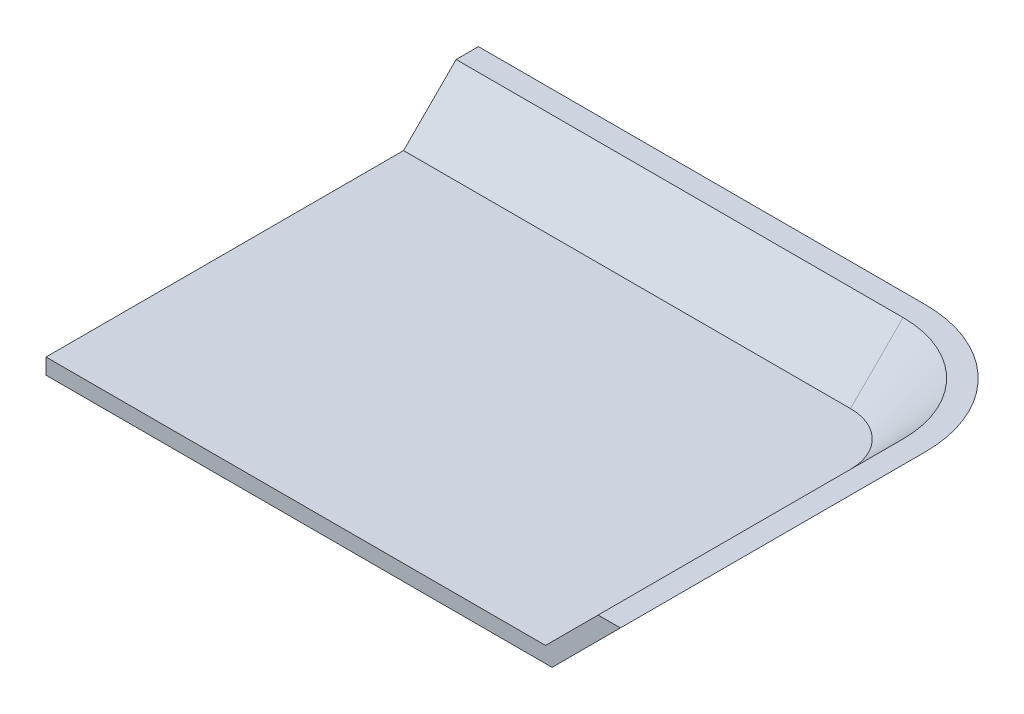
ISO-10303-21;
HEADER;
FILE_DESCRIPTION(('STEP AP214'),'2;1');
FILE_NAME('part.step','',(''),(''),'','','');
FILE_SCHEMA(('AUTOMOTIVE_DESIGN { 1 0 10303 214 1 1 1 1 }'));
ENDSEC;
DATA;
#1=APPLICATION_CONTEXT('core data for automotive mechanical design processes');
#2=APPLICATION_PROTOCOL_DEFINITION('international standard','automotive_design',2000,#1);
#3=PRODUCT_CONTEXT('',#1,'mechanical');
#4=PRODUCT('Part','Part','',(#3));
#5=PRODUCT_RELATED_PRODUCT_CATEGORY('part','',(#4));
#6=PRODUCT_DEFINITION_FORMATION('','',#4);
#7=PRODUCT_DEFINITION_CONTEXT('part definition',#1,'design');
#8=PRODUCT_DEFINITION('design','',#6,#7);
#9=PRODUCT_DEFINITION_SHAPE('','',#8);
#10=(LENGTH_UNIT() NAMED_UNIT(*) SI_UNIT(.MILLI.,.METRE.));
#11=(NAMED_UNIT(*) PLANE_ANGLE_UNIT() SI_UNIT($,.RADIAN.));
#12=(NAMED_UNIT(*) SI_UNIT($,.STERADIAN.) SOLID_ANGLE_UNIT());
#13=UNCERTAINTY_MEASURE_WITH_UNIT(LENGTH_MEASURE(1.E-05),#10,'distance_accuracy_value','');
#14=(GEOMETRIC_REPRESENTATION_CONTEXT(3) GLOBAL_UNCERTAINTY_ASSIGNED_CONTEXT((#13)) GLOBAL_UNIT_ASSIGNED_CONTEXT((#10,
#11,#12)) REPRESENTATION_CONTEXT('',''));
#15=CARTESIAN_POINT('',(0.,0.,0.));
#16=DIRECTION('',(0.,0.,1.));
#17=DIRECTION('',(1.,0.,0.));
#18=AXIS2_PLACEMENT_3D('',#15,#16,#17);
#19=CARTESIAN_POINT('',(0.,10.,0.));
#20=DIRECTION('',(0.,1.,0.));
#21=DIRECTION('',(0.,0.,1.));
#22=AXIS2_PLACEMENT_3D('',#19,#20,#21);
#23=PLANE('',#22);
#24=DIRECTION('',(-1.,0.,0.));
#25=VECTOR('',#24,1.);
#26=CARTESIAN_POINT('',(0.,10.,0.));
#27=LINE('',#26,#25);
#28=CARTESIAN_POINT('',(109.242640687119,10.,0.));
#29=VERTEX_POINT('',#28);
#30=CARTESIAN_POINT('',(105.,10.,0.));
#31=VERTEX_POINT('',#30);
#32=EDGE_CURVE('E121',#29,#31,#27,.T.);
#33=ORIENTED_EDGE('',*,*,#32,.F.);
#34=DIRECTION('',(0.,0.,-1.));
#35=VECTOR('',#34,1.);
#36=CARTESIAN_POINT('',(109.242640687119,10.,0.));
#37=LINE('',#36,#35);
#38=CARTESIAN_POINT('',(109.242640687119,10.,-58.));
#39=VERTEX_POINT('',#38);
#40=EDGE_CURVE('E131',#29,#39,#37,.T.);
#41=ORIENTED_EDGE('',*,*,#40,.T.);
#42=CARTESIAN_POINT('',(85.,10.,-58.));
#43=DIRECTION('',(0.,-1.,0.));
#44=DIRECTION('',(0.,0.,-1.));
#45=AXIS2_PLACEMENT_3D('',#42,#43,#44);
#46=CIRCLE('',#45,24.2426406871193);
#47=CARTESIAN_POINT('',(85.,10.,-82.2426406871193));
#48=VERTEX_POINT('',#47);
#49=EDGE_CURVE('E143',#48,#39,#46,.T.);
#50=ORIENTED_EDGE('',*,*,#49,.F.);
#51=DIRECTION('',(-1.,0.,0.));
#52=VECTOR('',#51,1.);
#53=CARTESIAN_POINT('',(0.,10.,-82.2426406871193));
#54=LINE('',#53,#52);
#55=CARTESIAN_POINT('',(0.,10.,-82.2426406871193));
#56=VERTEX_POINT('',#55);
#57=EDGE_CURVE('E137',#48,#56,#54,.T.);
#58=ORIENTED_EDGE('',*,*,#57,.T.);
#59=DIRECTION('',(0.,0.,-1.));
#60=VECTOR('',#59,1.);
#61=CARTESIAN_POINT('',(0.,10.,0.));
#62=LINE('',#61,#60);
#63=CARTESIAN_POINT('',(0.,10.,-78.));
#64=VERTEX_POINT('',#63);
#65=EDGE_CURVE('E132',#64,#56,#62,.T.);
#66=ORIENTED_EDGE('',*,*,#65,.F.);
#67=DIRECTION('',(-1.,0.,0.));
#68=VECTOR('',#67,1.);
#69=CARTESIAN_POINT('',(0.,10.,-78.));
#70=LINE('',#69,#68);
#71=CARTESIAN_POINT('',(85.,10.,-78.));
#72=VERTEX_POINT('',#71);
#73=EDGE_CURVE('E70',#72,#64,#70,.T.);
#74=ORIENTED_EDGE('',*,*,#73,.F.);
#75=CARTESIAN_POINT('',(85.,10.,-58.));
#76=DIRECTION('',(0.,-1.,0.));
#77=DIRECTION('',(0.,0.,-1.));
#78=AXIS2_PLACEMENT_3D('',#75,#76,#77);
#79=CIRCLE('',#78,20.);
#80=CARTESIAN_POINT('',(105.,10.,-58.));
#81=VERTEX_POINT('',#80);
#82=EDGE_CURVE('E37',#72,#81,#79,.T.);
#83=ORIENTED_EDGE('',*,*,#82,.T.);
#84=DIRECTION('',(0.,0.,-1.));
#85=VECTOR('',#84,1.);
#86=CARTESIAN_POINT('',(105.,10.,0.));
#87=LINE('',#86,#85);
#88=EDGE_CURVE('E49',#31,#81,#87,.T.);
#89=ORIENTED_EDGE('',*,*,#88,.F.);
#90=EDGE_LOOP('',(#33,#41,#50,#58,#66,#74,#83,#89));
#91=FACE_BOUND('',#90,.T.);
#92=ADVANCED_FACE('F33',(#91),#23,.T.);
#93=CARTESIAN_POINT('',(0.,10.,0.));
#94=DIRECTION('',(-1.,0.,0.));
#95=DIRECTION('',(0.,0.,1.));
#96=AXIS2_PLACEMENT_3D('',#93,#94,#95);
#97=PLANE('',#96);
#98=DIRECTION('',(0.,0.707106781186549,-0.707106781186546));
#99=VECTOR('',#98,1.);
#100=CARTESIAN_POINT('',(0.,-29.,-39.0000000000002));
#101=LINE('',#100,#99);
#102=CARTESIAN_POINT('',(0.,0.,-68.));
#103=VERTEX_POINT('',#102);
#104=EDGE_CURVE('E160',#103,#64,#101,.T.);
#105=ORIENTED_EDGE('',*,*,#104,.T.);
#106=ORIENTED_EDGE('',*,*,#65,.T.);
#107=DIRECTION('',(0.,0.707106781186549,-0.707106781186546));
#108=VECTOR('',#107,1.);
#109=CARTESIAN_POINT('',(0.,-31.1213203435596,-41.1213203435598));
#110=LINE('',#109,#108);
#111=CARTESIAN_POINT('',(0.,-3.,-69.2426406871193));
#112=VERTEX_POINT('',#111);
#113=EDGE_CURVE('E127',#112,#56,#110,.T.);
#114=ORIENTED_EDGE('',*,*,#113,.F.);
#115=DIRECTION('',(0.,0.,1.));
#116=VECTOR('',#115,1.);
#117=CARTESIAN_POINT('',(0.,-3.,0.));
#118=LINE('',#117,#116);
#119=CARTESIAN_POINT('',(0.,-3.,0.));
#120=VERTEX_POINT('',#119);
#121=EDGE_CURVE('E172',#112,#120,#118,.T.);
#122=ORIENTED_EDGE('',*,*,#121,.T.);
#123=DIRECTION('',(0.,-1.,0.));
#124=VECTOR('',#123,1.);
#125=CARTESIAN_POINT('',(0.,10.,0.));
#126=LINE('',#125,#124);
#127=CARTESIAN_POINT('',(0.,0.,0.));
#128=VERTEX_POINT('',#127);
#129=EDGE_CURVE('E145',#128,#120,#126,.T.);
#130=ORIENTED_EDGE('',*,*,#129,.F.);
#131=DIRECTION('',(0.,0.,1.));
#132=VECTOR('',#131,1.);
#133=CARTESIAN_POINT('',(0.,0.,0.));
#134=LINE('',#133,#132);
#135=EDGE_CURVE('E149',#103,#128,#134,.T.);
#136=ORIENTED_EDGE('',*,*,#135,.F.);
#137=EDGE_LOOP('',(#105,#106,#114,#122,#130,#136));
#138=FACE_BOUND('',#137,.T.);
#139=ADVANCED_FACE('F184',(#138),#97,.T.);
#140=CARTESIAN_POINT('',(0.,-2.12132034355964,-70.1213203435597));
#141=DIRECTION('',(0.,-0.707106781186546,-0.707106781186549));
#142=DIRECTION('',(1.,0.,0.));
#143=AXIS2_PLACEMENT_3D('',#140,#141,#142);
#144=PLANE('',#143);
#145=ORIENTED_EDGE('',*,*,#113,.T.);
#146=ORIENTED_EDGE('',*,*,#57,.F.);
#147=DIRECTION('',(0.,0.70710678118655,-0.707106781186545));
#148=VECTOR('',#147,1.);
#149=CARTESIAN_POINT('',(85.,-2.12132034355964,-70.1213203435597));
#150=LINE('',#149,#148);
#151=CARTESIAN_POINT('',(85.,-3.,-69.2426406871193));
#152=VERTEX_POINT('',#151);
#153=EDGE_CURVE('E170',#48,#152,#150,.F.);
#154=ORIENTED_EDGE('',*,*,#153,.T.);
#155=DIRECTION('',(-1.,0.,0.));
#156=VECTOR('',#155,1.);
#157=CARTESIAN_POINT('',(0.,-3.,-69.2426406871193));
#158=LINE('',#157,#156);
#159=EDGE_CURVE('E146',#152,#112,#158,.T.);
#160=ORIENTED_EDGE('',*,*,#159,.T.);
#161=EDGE_LOOP('',(#145,#146,#154,#160));
#162=FACE_BOUND('',#161,.T.);
#163=ADVANCED_FACE('F180',(#162),#144,.T.);
#164=CARTESIAN_POINT('',(85.,-2.12132034355964,-58.));
#165=DIRECTION('',(0.,1.,0.));
#166=DIRECTION('',(0.,0.,-1.));
#167=AXIS2_PLACEMENT_3D('',#164,#165,#166);
#168=CONICAL_SURFACE('',#167,12.1213203435597,0.785398163397445);
#169=ORIENTED_EDGE('',*,*,#153,.F.);
#170=ORIENTED_EDGE('',*,*,#49,.T.);
#171=DIRECTION('',(0.707106781186547,0.707106781186548,0.));
#172=VECTOR('',#171,1.);
#173=CARTESIAN_POINT('',(97.1213203435596,-2.12132034355964,-58.));
#174=LINE('',#173,#172);
#175=CARTESIAN_POINT('',(96.2426406871193,-3.,-58.));
#176=VERTEX_POINT('',#175);
#177=EDGE_CURVE('E135',#39,#176,#174,.F.);
#178=ORIENTED_EDGE('',*,*,#177,.T.);
#179=CARTESIAN_POINT('',(85.,-3.,-58.));
#180=DIRECTION('',(0.,-1.,0.));
#181=DIRECTION('',(0.,0.,-1.));
#182=AXIS2_PLACEMENT_3D('',#179,#180,#181);
#183=CIRCLE('',#182,11.2426406871193);
#184=EDGE_CURVE('E166',#176,#152,#183,.F.);
#185=ORIENTED_EDGE('',*,*,#184,.T.);
#186=EDGE_LOOP('',(#169,#170,#178,#185));
#187=FACE_BOUND('',#186,.T.);
#188=ADVANCED_FACE('F186',(#187),#168,.T.);
#189=CARTESIAN_POINT('',(0.,-3.,0.));
#190=DIRECTION('',(0.,1.,0.));
#191=DIRECTION('',(0.,0.,-1.));
#192=AXIS2_PLACEMENT_3D('',#189,#190,#191);
#193=PLANE('',#192);
#194=DIRECTION('',(1.,0.,0.));
#195=VECTOR('',#194,1.);
#196=CARTESIAN_POINT('',(0.,-3.,0.));
#197=LINE('',#196,#195);
#198=CARTESIAN_POINT('',(96.2426406871193,-3.,0.));
#199=VERTEX_POINT('',#198);
#200=EDGE_CURVE('E122',#120,#199,#197,.T.);
#201=ORIENTED_EDGE('',*,*,#200,.F.);
#202=ORIENTED_EDGE('',*,*,#121,.F.);
#203=ORIENTED_EDGE('',*,*,#159,.F.);
#204=ORIENTED_EDGE('',*,*,#184,.F.);
#205=DIRECTION('',(0.,0.,-1.));
#206=VECTOR('',#205,1.);
#207=CARTESIAN_POINT('',(96.2426406871193,-3.,0.));
#208=LINE('',#207,#206);
#209=EDGE_CURVE('E126',#199,#176,#208,.T.);
#210=ORIENTED_EDGE('',*,*,#209,.F.);
#211=EDGE_LOOP('',(#201,#202,#203,#204,#210));
#212=FACE_BOUND('',#211,.T.);
#213=ADVANCED_FACE('F189',(#212),#193,.F.);
#214=CARTESIAN_POINT('',(0.,0.,0.));
#215=DIRECTION('',(0.,1.,0.));
#216=DIRECTION('',(0.,0.,-1.));
#217=AXIS2_PLACEMENT_3D('',#214,#215,#216);
#218=PLANE('',#217);
#219=DIRECTION('',(1.,0.,0.));
#220=VECTOR('',#219,1.);
#221=CARTESIAN_POINT('',(0.,0.,0.));
#222=LINE('',#221,#220);
#223=CARTESIAN_POINT('',(95.,0.,0.));
#224=VERTEX_POINT('',#223);
#225=EDGE_CURVE('E58',#128,#224,#222,.T.);
#226=ORIENTED_EDGE('',*,*,#225,.T.);
#227=DIRECTION('',(0.,0.,-1.));
#228=VECTOR('',#227,1.);
#229=CARTESIAN_POINT('',(95.,0.,-58.));
#230=LINE('',#229,#228);
#231=CARTESIAN_POINT('',(95.,0.,-58.));
#232=VERTEX_POINT('',#231);
#233=EDGE_CURVE('E155',#224,#232,#230,.T.);
#234=ORIENTED_EDGE('',*,*,#233,.T.);
#235=CARTESIAN_POINT('',(85.,0.,-58.));
#236=DIRECTION('',(0.,-1.,0.));
#237=DIRECTION('',(0.,0.,-1.));
#238=AXIS2_PLACEMENT_3D('',#235,#236,#237);
#239=CIRCLE('',#238,10.);
#240=CARTESIAN_POINT('',(85.,0.,-68.));
#241=VERTEX_POINT('',#240);
#242=EDGE_CURVE('E153',#232,#241,#239,.F.);
#243=ORIENTED_EDGE('',*,*,#242,.T.);
#244=DIRECTION('',(-1.,0.,0.));
#245=VECTOR('',#244,1.);
#246=CARTESIAN_POINT('',(0.,0.,-68.));
#247=LINE('',#246,#245);
#248=EDGE_CURVE('E80',#241,#103,#247,.T.);
#249=ORIENTED_EDGE('',*,*,#248,.T.);
#250=ORIENTED_EDGE('',*,*,#135,.T.);
#251=EDGE_LOOP('',(#226,#234,#243,#249,#250));
#252=FACE_BOUND('',#251,.T.);
#253=ADVANCED_FACE('F193',(#252),#218,.T.);
#254=CARTESIAN_POINT('',(85.,0.,-58.));
#255=DIRECTION('',(0.,1.,0.));
#256=DIRECTION('',(0.,0.,-1.));
#257=AXIS2_PLACEMENT_3D('',#254,#255,#256);
#258=CONICAL_SURFACE('',#257,10.,0.785398163397445);
#259=DIRECTION('',(0.,-0.707106781186549,0.707106781186546));
#260=VECTOR('',#259,1.);
#261=CARTESIAN_POINT('',(85.,10.,-78.));
#262=LINE('',#261,#260);
#263=EDGE_CURVE('E42',#72,#241,#262,.T.);
#264=ORIENTED_EDGE('',*,*,#263,.T.);
#265=ORIENTED_EDGE('',*,*,#242,.F.);
#266=DIRECTION('',(-0.707106781186546,-0.707106781186549,0.));
#267=VECTOR('',#266,1.);
#268=CARTESIAN_POINT('',(105.,10.,-58.));
#269=LINE('',#268,#267);
#270=EDGE_CURVE('E12',#81,#232,#269,.T.);
#271=ORIENTED_EDGE('',*,*,#270,.F.);
#272=ORIENTED_EDGE('',*,*,#82,.F.);
#273=EDGE_LOOP('',(#264,#265,#271,#272));
#274=FACE_BOUND('',#273,.T.);
#275=ADVANCED_FACE('F196',(#274),#258,.F.);
#276=CARTESIAN_POINT('',(0.,10.,0.));
#277=DIRECTION('',(0.,0.,1.));
#278=DIRECTION('',(1.,0.,0.));
#279=AXIS2_PLACEMENT_3D('',#276,#277,#278);
#280=PLANE('',#279);
#281=DIRECTION('',(-0.707106781186547,-0.707106781186548,0.));
#282=VECTOR('',#281,1.);
#283=CARTESIAN_POINT('',(54.6213203435597,-44.6213203435596,0.));
#284=LINE('',#283,#282);
#285=EDGE_CURVE('E119',#29,#199,#284,.T.);
#286=ORIENTED_EDGE('',*,*,#285,.F.);
#287=ORIENTED_EDGE('',*,*,#32,.T.);
#288=DIRECTION('',(-0.707106781186547,-0.707106781186548,0.));
#289=VECTOR('',#288,1.);
#290=CARTESIAN_POINT('',(52.5,-42.5,0.));
#291=LINE('',#290,#289);
#292=EDGE_CURVE('E158',#31,#224,#291,.T.);
#293=ORIENTED_EDGE('',*,*,#292,.T.);
#294=ORIENTED_EDGE('',*,*,#225,.F.);
#295=ORIENTED_EDGE('',*,*,#129,.T.);
#296=ORIENTED_EDGE('',*,*,#200,.T.);
#297=EDGE_LOOP('',(#286,#287,#293,#294,#295,#296));
#298=FACE_BOUND('',#297,.T.);
#299=ADVANCED_FACE('F35',(#298),#280,.T.);
#300=CARTESIAN_POINT('',(95.,0.,0.));
#301=DIRECTION('',(0.707106781186548,-0.707106781186547,0.));
#302=DIRECTION('',(0.,0.,1.));
#303=AXIS2_PLACEMENT_3D('',#300,#301,#302);
#304=PLANE('',#303);
#305=ORIENTED_EDGE('',*,*,#292,.F.);
#306=ORIENTED_EDGE('',*,*,#88,.T.);
#307=ORIENTED_EDGE('',*,*,#270,.T.);
#308=ORIENTED_EDGE('',*,*,#233,.F.);
#309=EDGE_LOOP('',(#305,#306,#307,#308));
#310=FACE_BOUND('',#309,.T.);
#311=ADVANCED_FACE('F197',(#310),#304,.F.);
#312=CARTESIAN_POINT('',(97.1213203435596,-2.12132034355964,0.));
#313=DIRECTION('',(0.707106781186548,-0.707106781186547,0.));
#314=DIRECTION('',(0.,0.,1.));
#315=AXIS2_PLACEMENT_3D('',#312,#313,#314);
#316=PLANE('',#315);
#317=ORIENTED_EDGE('',*,*,#285,.T.);
#318=ORIENTED_EDGE('',*,*,#209,.T.);
#319=ORIENTED_EDGE('',*,*,#177,.F.);
#320=ORIENTED_EDGE('',*,*,#40,.F.);
#321=EDGE_LOOP('',(#317,#318,#319,#320));
#322=FACE_BOUND('',#321,.T.);
#323=ADVANCED_FACE('F134',(#322),#316,.T.);
#324=CARTESIAN_POINT('',(0.,0.,-68.));
#325=DIRECTION('',(0.,-0.707106781186546,-0.707106781186549));
#326=DIRECTION('',(1.,0.,0.));
#327=AXIS2_PLACEMENT_3D('',#324,#325,#326);
#328=PLANE('',#327);
#329=ORIENTED_EDGE('',*,*,#104,.F.);
#330=ORIENTED_EDGE('',*,*,#248,.F.);
#331=ORIENTED_EDGE('',*,*,#263,.F.);
#332=ORIENTED_EDGE('',*,*,#73,.T.);
#333=EDGE_LOOP('',(#329,#330,#331,#332));
#334=FACE_BOUND('',#333,.T.);
#335=ADVANCED_FACE('F191',(#334),#328,.F.);
#336=CLOSED_SHELL('',(#92,#139,#163,#188,#213,#253,#275,#299,#311,#323,#335));
#337=MANIFOLD_SOLID_BREP('B2',#336);
#338=ADVANCED_BREP_SHAPE_REPRESENTATION('',(#18,#337),#14);
#339=SHAPE_DEFINITION_REPRESENTATION(#9,#338);
ENDSEC;
END-ISO-10303-21;
